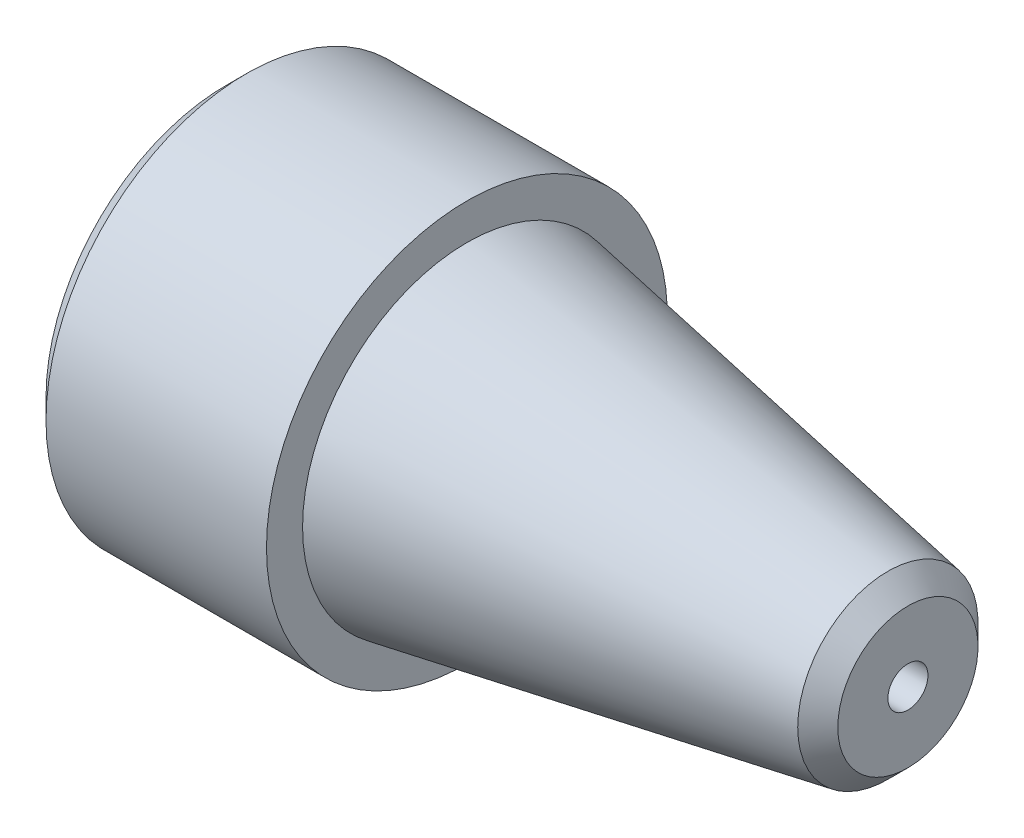
ISO-10303-21;
HEADER;
FILE_DESCRIPTION(('STEP AP214'),'2;1');
FILE_NAME('part.step','',(''),(''),'','','');
FILE_SCHEMA(('AUTOMOTIVE_DESIGN { 1 0 10303 214 1 1 1 1 }'));
ENDSEC;
DATA;
#1=APPLICATION_CONTEXT('core data for automotive mechanical design processes');
#2=APPLICATION_PROTOCOL_DEFINITION('international standard','automotive_design',2000,#1);
#3=PRODUCT_CONTEXT('',#1,'mechanical');
#4=PRODUCT('Part','Part','',(#3));
#5=PRODUCT_RELATED_PRODUCT_CATEGORY('part','',(#4));
#6=PRODUCT_DEFINITION_FORMATION('','',#4);
#7=PRODUCT_DEFINITION_CONTEXT('part definition',#1,'design');
#8=PRODUCT_DEFINITION('design','',#6,#7);
#9=PRODUCT_DEFINITION_SHAPE('','',#8);
#10=(LENGTH_UNIT() NAMED_UNIT(*) SI_UNIT(.MILLI.,.METRE.));
#11=(NAMED_UNIT(*) PLANE_ANGLE_UNIT() SI_UNIT($,.RADIAN.));
#12=(NAMED_UNIT(*) SI_UNIT($,.STERADIAN.) SOLID_ANGLE_UNIT());
#13=UNCERTAINTY_MEASURE_WITH_UNIT(LENGTH_MEASURE(1.E-05),#10,'distance_accuracy_value','');
#14=(GEOMETRIC_REPRESENTATION_CONTEXT(3) GLOBAL_UNCERTAINTY_ASSIGNED_CONTEXT((#13)) GLOBAL_UNIT_ASSIGNED_CONTEXT((#10,
#11,#12)) REPRESENTATION_CONTEXT('',''));
#15=CARTESIAN_POINT('',(0.,0.,0.));
#16=DIRECTION('',(0.,0.,1.));
#17=DIRECTION('',(1.,0.,0.));
#18=AXIS2_PLACEMENT_3D('',#15,#16,#17);
#19=CARTESIAN_POINT('',(0.,1.,0.));
#20=DIRECTION('',(1.,0.,0.));
#21=DIRECTION('',(0.,0.,-1.));
#22=AXIS2_PLACEMENT_3D('',#19,#20,#21);
#23=PLANE('',#22);
#24=CARTESIAN_POINT('',(0.,0.,0.));
#25=DIRECTION('',(-1.,0.,0.));
#26=DIRECTION('',(0.,0.,1.));
#27=AXIS2_PLACEMENT_3D('',#24,#25,#26);
#28=CIRCLE('',#27,1.);
#29=CARTESIAN_POINT('',(0.,0.,1.));
#30=VERTEX_POINT('',#29);
#31=EDGE_CURVE('E59',#30,#30,#28,.T.);
#32=ORIENTED_EDGE('',*,*,#31,.F.);
#33=EDGE_LOOP('',(#32));
#34=FACE_BOUND('',#33,.T.);
#35=CARTESIAN_POINT('',(0.,0.,0.));
#36=DIRECTION('',(-1.,0.,0.));
#37=DIRECTION('',(0.,0.,1.));
#38=AXIS2_PLACEMENT_3D('',#35,#36,#37);
#39=CIRCLE('',#38,9.);
#40=CARTESIAN_POINT('',(0.,0.,9.));
#41=VERTEX_POINT('',#40);
#42=EDGE_CURVE('E10',#41,#41,#39,.T.);
#43=ORIENTED_EDGE('',*,*,#42,.T.);
#44=EDGE_LOOP('',(#43));
#45=FACE_BOUND('',#44,.T.);
#46=ADVANCED_FACE('F31',(#34,#45),#23,.F.);
#47=CARTESIAN_POINT('',(1.,0.,0.));
#48=DIRECTION('',(1.,0.,0.));
#49=DIRECTION('',(0.,0.,-1.));
#50=AXIS2_PLACEMENT_3D('',#47,#48,#49);
#51=CONICAL_SURFACE('',#50,10.,0.785398163397447);
#52=ORIENTED_EDGE('',*,*,#42,.F.);
#53=EDGE_LOOP('',(#52));
#54=FACE_BOUND('',#53,.T.);
#55=CARTESIAN_POINT('',(1.,0.,0.));
#56=DIRECTION('',(-1.,0.,0.));
#57=DIRECTION('',(0.,0.,1.));
#58=AXIS2_PLACEMENT_3D('',#55,#56,#57);
#59=CIRCLE('',#58,10.);
#60=CARTESIAN_POINT('',(1.,0.,10.));
#61=VERTEX_POINT('',#60);
#62=EDGE_CURVE('E37',#61,#61,#59,.T.);
#63=ORIENTED_EDGE('',*,*,#62,.T.);
#64=EDGE_LOOP('',(#63));
#65=FACE_BOUND('',#64,.T.);
#66=ADVANCED_FACE('F66',(#54,#65),#51,.T.);
#67=CARTESIAN_POINT('',(-9.57665297106658,0.,0.));
#68=DIRECTION('',(-1.,0.,0.));
#69=DIRECTION('',(0.,0.,1.));
#70=AXIS2_PLACEMENT_3D('',#67,#68,#69);
#71=CYLINDRICAL_SURFACE('',#70,10.);
#72=ORIENTED_EDGE('',*,*,#62,.F.);
#73=EDGE_LOOP('',(#72));
#74=FACE_BOUND('',#73,.T.);
#75=CARTESIAN_POINT('',(12.,0.,0.));
#76=DIRECTION('',(-1.,0.,0.));
#77=DIRECTION('',(0.,0.,1.));
#78=AXIS2_PLACEMENT_3D('',#75,#76,#77);
#79=CIRCLE('',#78,10.);
#80=CARTESIAN_POINT('',(12.,0.,10.));
#81=VERTEX_POINT('',#80);
#82=EDGE_CURVE('E41',#81,#81,#79,.T.);
#83=ORIENTED_EDGE('',*,*,#82,.T.);
#84=EDGE_LOOP('',(#83));
#85=FACE_BOUND('',#84,.T.);
#86=ADVANCED_FACE('F70',(#74,#85),#71,.T.);
#87=CARTESIAN_POINT('',(12.,10.,0.));
#88=DIRECTION('',(-1.,0.,0.));
#89=DIRECTION('',(0.,0.,1.));
#90=AXIS2_PLACEMENT_3D('',#87,#88,#89);
#91=PLANE('',#90);
#92=ORIENTED_EDGE('',*,*,#82,.F.);
#93=EDGE_LOOP('',(#92));
#94=FACE_BOUND('',#93,.T.);
#95=CARTESIAN_POINT('',(12.,0.,0.));
#96=DIRECTION('',(-1.,0.,0.));
#97=DIRECTION('',(0.,0.,1.));
#98=AXIS2_PLACEMENT_3D('',#95,#96,#97);
#99=CIRCLE('',#98,8.2);
#100=CARTESIAN_POINT('',(12.,0.,8.2));
#101=VERTEX_POINT('',#100);
#102=EDGE_CURVE('E45',#101,#101,#99,.T.);
#103=ORIENTED_EDGE('',*,*,#102,.T.);
#104=EDGE_LOOP('',(#103));
#105=FACE_BOUND('',#104,.T.);
#106=ADVANCED_FACE('F75',(#94,#105),#91,.F.);
#107=CARTESIAN_POINT('',(33.,0.,0.));
#108=DIRECTION('',(-1.,0.,0.));
#109=DIRECTION('',(0.,0.,1.));
#110=AXIS2_PLACEMENT_3D('',#107,#108,#109);
#111=CONICAL_SURFACE('',#110,4.49713340512224,0.174532925199433);
#112=ORIENTED_EDGE('',*,*,#102,.F.);
#113=EDGE_LOOP('',(#112));
#114=FACE_BOUND('',#113,.T.);
#115=CARTESIAN_POINT('',(33.,0.,0.));
#116=DIRECTION('',(-1.,0.,0.));
#117=DIRECTION('',(0.,0.,1.));
#118=AXIS2_PLACEMENT_3D('',#115,#116,#117);
#119=CIRCLE('',#118,4.49713340512224);
#120=CARTESIAN_POINT('',(33.,0.,4.49713340512224));
#121=VERTEX_POINT('',#120);
#122=EDGE_CURVE('E50',#121,#121,#119,.T.);
#123=ORIENTED_EDGE('',*,*,#122,.T.);
#124=EDGE_LOOP('',(#123));
#125=FACE_BOUND('',#124,.T.);
#126=ADVANCED_FACE('F81',(#114,#125),#111,.T.);
#127=CARTESIAN_POINT('',(34.,0.,0.));
#128=DIRECTION('',(-1.,0.,0.));
#129=DIRECTION('',(0.,0.,1.));
#130=AXIS2_PLACEMENT_3D('',#127,#128,#129);
#131=CONICAL_SURFACE('',#130,3.49713340512224,0.785398163397449);
#132=ORIENTED_EDGE('',*,*,#122,.F.);
#133=EDGE_LOOP('',(#132));
#134=FACE_BOUND('',#133,.T.);
#135=CARTESIAN_POINT('',(34.,0.,0.));
#136=DIRECTION('',(-1.,0.,0.));
#137=DIRECTION('',(0.,0.,1.));
#138=AXIS2_PLACEMENT_3D('',#135,#136,#137);
#139=CIRCLE('',#138,3.49713340512224);
#140=CARTESIAN_POINT('',(34.,0.,3.49713340512224));
#141=VERTEX_POINT('',#140);
#142=EDGE_CURVE('E53',#141,#141,#139,.T.);
#143=ORIENTED_EDGE('',*,*,#142,.T.);
#144=EDGE_LOOP('',(#143));
#145=FACE_BOUND('',#144,.T.);
#146=ADVANCED_FACE('F85',(#134,#145),#131,.T.);
#147=CARTESIAN_POINT('',(34.,3.49713340512224,0.));
#148=DIRECTION('',(-1.,0.,0.));
#149=DIRECTION('',(0.,0.,1.));
#150=AXIS2_PLACEMENT_3D('',#147,#148,#149);
#151=PLANE('',#150);
#152=ORIENTED_EDGE('',*,*,#142,.F.);
#153=EDGE_LOOP('',(#152));
#154=FACE_BOUND('',#153,.T.);
#155=CARTESIAN_POINT('',(34.,0.,0.));
#156=DIRECTION('',(-1.,0.,0.));
#157=DIRECTION('',(0.,0.,1.));
#158=AXIS2_PLACEMENT_3D('',#155,#156,#157);
#159=CIRCLE('',#158,1.00000000000001);
#160=CARTESIAN_POINT('',(34.,0.,1.00000000000001));
#161=VERTEX_POINT('',#160);
#162=EDGE_CURVE('E56',#161,#161,#159,.T.);
#163=ORIENTED_EDGE('',*,*,#162,.T.);
#164=EDGE_LOOP('',(#163));
#165=FACE_BOUND('',#164,.T.);
#166=ADVANCED_FACE('F89',(#154,#165),#151,.F.);
#167=CARTESIAN_POINT('',(-9.57665297106658,0.,0.));
#168=DIRECTION('',(-1.,0.,0.));
#169=DIRECTION('',(0.,0.,1.));
#170=AXIS2_PLACEMENT_3D('',#167,#168,#169);
#171=CYLINDRICAL_SURFACE('',#170,1.);
#172=ORIENTED_EDGE('',*,*,#162,.F.);
#173=EDGE_LOOP('',(#172));
#174=FACE_BOUND('',#173,.T.);
#175=ORIENTED_EDGE('',*,*,#31,.T.);
#176=EDGE_LOOP('',(#175));
#177=FACE_BOUND('',#176,.T.);
#178=ADVANCED_FACE('F63',(#174,#177),#171,.F.);
#179=CLOSED_SHELL('',(#46,#66,#86,#106,#126,#146,#166,#178));
#180=MANIFOLD_SOLID_BREP('B2',#179);
#181=ADVANCED_BREP_SHAPE_REPRESENTATION('',(#18,#180),#14);
#182=SHAPE_DEFINITION_REPRESENTATION(#9,#181);
ENDSEC;
END-ISO-10303-21;
